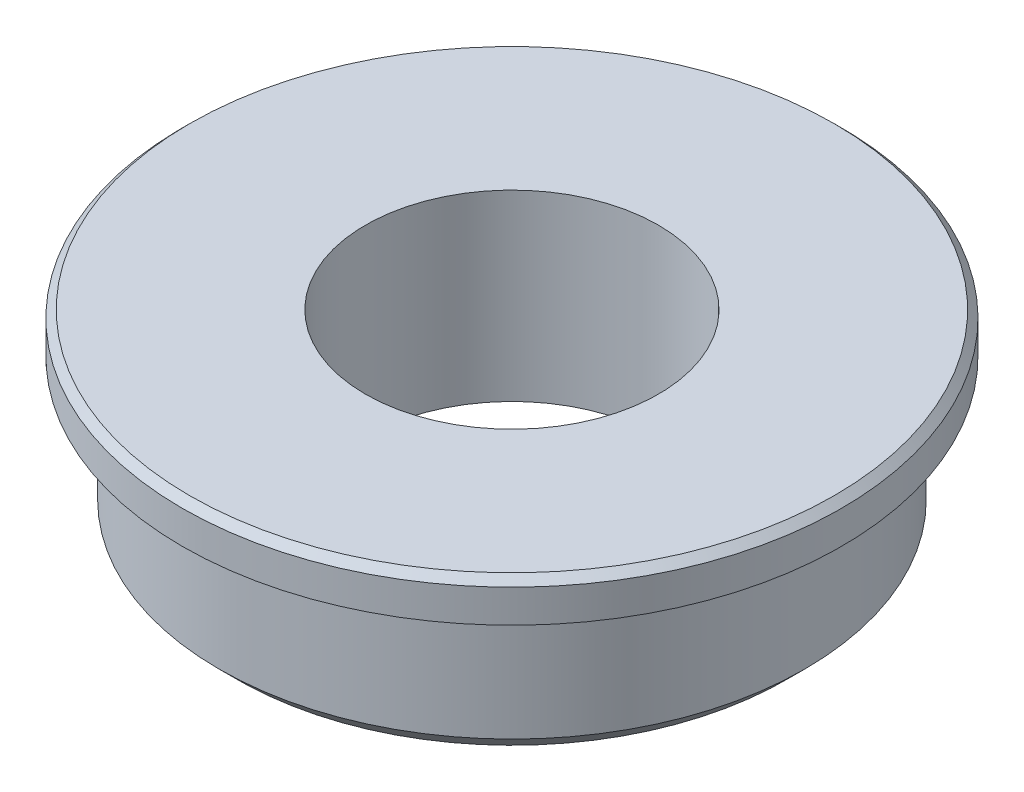
ISO-10303-21;
HEADER;
FILE_DESCRIPTION(('STEP AP214'),'2;1');
FILE_NAME('part.step','',(''),(''),'','','');
FILE_SCHEMA(('AUTOMOTIVE_DESIGN { 1 0 10303 214 1 1 1 1 }'));
ENDSEC;
DATA;
#1=APPLICATION_CONTEXT('core data for automotive mechanical design processes');
#2=APPLICATION_PROTOCOL_DEFINITION('international standard','automotive_design',2000,#1);
#3=PRODUCT_CONTEXT('',#1,'mechanical');
#4=PRODUCT('Part','Part','',(#3));
#5=PRODUCT_RELATED_PRODUCT_CATEGORY('part','',(#4));
#6=PRODUCT_DEFINITION_FORMATION('','',#4);
#7=PRODUCT_DEFINITION_CONTEXT('part definition',#1,'design');
#8=PRODUCT_DEFINITION('design','',#6,#7);
#9=PRODUCT_DEFINITION_SHAPE('','',#8);
#10=(LENGTH_UNIT() NAMED_UNIT(*) SI_UNIT(.MILLI.,.METRE.));
#11=(NAMED_UNIT(*) PLANE_ANGLE_UNIT() SI_UNIT($,.RADIAN.));
#12=(NAMED_UNIT(*) SI_UNIT($,.STERADIAN.) SOLID_ANGLE_UNIT());
#13=UNCERTAINTY_MEASURE_WITH_UNIT(LENGTH_MEASURE(1.E-05),#10,'distance_accuracy_value','');
#14=(GEOMETRIC_REPRESENTATION_CONTEXT(3) GLOBAL_UNCERTAINTY_ASSIGNED_CONTEXT((#13)) GLOBAL_UNIT_ASSIGNED_CONTEXT((#10,
#11,#12)) REPRESENTATION_CONTEXT('',''));
#15=CARTESIAN_POINT('',(0.,0.,0.));
#16=DIRECTION('',(0.,0.,1.));
#17=DIRECTION('',(1.,0.,0.));
#18=AXIS2_PLACEMENT_3D('',#15,#16,#17);
#19=CARTESIAN_POINT('',(0.,10.756386759865,0.));
#20=DIRECTION('',(0.,1.,0.));
#21=DIRECTION('',(0.,0.,1.));
#22=AXIS2_PLACEMENT_3D('',#19,#20,#21);
#23=CYLINDRICAL_SURFACE('',#22,4.);
#24=CARTESIAN_POINT('',(0.,5.,0.));
#25=DIRECTION('',(0.,1.,0.));
#26=DIRECTION('',(0.,0.,1.));
#27=AXIS2_PLACEMENT_3D('',#24,#25,#26);
#28=CIRCLE('',#27,4.);
#29=CARTESIAN_POINT('',(0.,5.,4.));
#30=VERTEX_POINT('',#29);
#31=EDGE_CURVE('E62',#30,#30,#28,.T.);
#32=ORIENTED_EDGE('',*,*,#31,.T.);
#33=EDGE_LOOP('',(#32));
#34=FACE_BOUND('',#33,.T.);
#35=CARTESIAN_POINT('',(0.,0.,0.));
#36=DIRECTION('',(0.,1.,0.));
#37=DIRECTION('',(0.,0.,1.));
#38=AXIS2_PLACEMENT_3D('',#35,#36,#37);
#39=CIRCLE('',#38,4.);
#40=CARTESIAN_POINT('',(0.,0.,4.));
#41=VERTEX_POINT('',#40);
#42=EDGE_CURVE('E53',#41,#41,#39,.T.);
#43=ORIENTED_EDGE('',*,*,#42,.F.);
#44=EDGE_LOOP('',(#43));
#45=FACE_BOUND('',#44,.T.);
#46=ADVANCED_FACE('F33',(#34,#45),#23,.F.);
#47=CARTESIAN_POINT('',(-4.,0.,0.));
#48=DIRECTION('',(0.,-1.,0.));
#49=DIRECTION('',(0.,0.,-1.));
#50=AXIS2_PLACEMENT_3D('',#47,#48,#49);
#51=PLANE('',#50);
#52=CARTESIAN_POINT('',(0.,0.,0.));
#53=DIRECTION('',(0.,-1.,0.));
#54=DIRECTION('',(0.,0.,-1.));
#55=AXIS2_PLACEMENT_3D('',#52,#53,#54);
#56=CIRCLE('',#55,7.49999999999999);
#57=CARTESIAN_POINT('',(0.,0.,-7.49999999999999));
#58=VERTEX_POINT('',#57);
#59=EDGE_CURVE('E44',#58,#58,#56,.T.);
#60=ORIENTED_EDGE('',*,*,#59,.T.);
#61=EDGE_LOOP('',(#60));
#62=FACE_BOUND('',#61,.T.);
#63=ORIENTED_EDGE('',*,*,#42,.T.);
#64=EDGE_LOOP('',(#63));
#65=FACE_BOUND('',#64,.T.);
#66=ADVANCED_FACE('F81',(#62,#65),#51,.T.);
#67=CARTESIAN_POINT('',(0.,10.756386759865,0.));
#68=DIRECTION('',(0.,1.,0.));
#69=DIRECTION('',(0.,0.,1.));
#70=AXIS2_PLACEMENT_3D('',#67,#68,#69);
#71=CYLINDRICAL_SURFACE('',#70,8.);
#72=CARTESIAN_POINT('',(0.,0.500000000000006,0.));
#73=DIRECTION('',(0.,-1.,0.));
#74=DIRECTION('',(0.,0.,-1.));
#75=AXIS2_PLACEMENT_3D('',#72,#73,#74);
#76=CIRCLE('',#75,8.);
#77=CARTESIAN_POINT('',(0.,0.500000000000006,-8.));
#78=VERTEX_POINT('',#77);
#79=EDGE_CURVE('E48',#78,#78,#76,.F.);
#80=ORIENTED_EDGE('',*,*,#79,.T.);
#81=EDGE_LOOP('',(#80));
#82=FACE_BOUND('',#81,.T.);
#83=CARTESIAN_POINT('',(0.,3.9,0.));
#84=DIRECTION('',(0.,1.,0.));
#85=DIRECTION('',(0.,0.,1.));
#86=AXIS2_PLACEMENT_3D('',#83,#84,#85);
#87=CIRCLE('',#86,8.);
#88=CARTESIAN_POINT('',(0.,3.9,8.));
#89=VERTEX_POINT('',#88);
#90=EDGE_CURVE('E56',#89,#89,#87,.T.);
#91=ORIENTED_EDGE('',*,*,#90,.F.);
#92=EDGE_LOOP('',(#91));
#93=FACE_BOUND('',#92,.T.);
#94=ADVANCED_FACE('F86',(#82,#93),#71,.T.);
#95=CARTESIAN_POINT('',(-8.,3.9,0.));
#96=DIRECTION('',(0.,-1.,0.));
#97=DIRECTION('',(0.,0.,-1.));
#98=AXIS2_PLACEMENT_3D('',#95,#96,#97);
#99=PLANE('',#98);
#100=ORIENTED_EDGE('',*,*,#90,.T.);
#101=EDGE_LOOP('',(#100));
#102=FACE_BOUND('',#101,.T.);
#103=CARTESIAN_POINT('',(0.,3.9,0.));
#104=DIRECTION('',(0.,1.,0.));
#105=DIRECTION('',(0.,0.,1.));
#106=AXIS2_PLACEMENT_3D('',#103,#104,#105);
#107=CIRCLE('',#106,9.);
#108=CARTESIAN_POINT('',(0.,3.9,9.));
#109=VERTEX_POINT('',#108);
#110=EDGE_CURVE('E59',#109,#109,#107,.T.);
#111=ORIENTED_EDGE('',*,*,#110,.F.);
#112=EDGE_LOOP('',(#111));
#113=FACE_BOUND('',#112,.T.);
#114=ADVANCED_FACE('F78',(#102,#113),#99,.T.);
#115=CARTESIAN_POINT('',(0.,10.756386759865,0.));
#116=DIRECTION('',(0.,1.,0.));
#117=DIRECTION('',(0.,0.,1.));
#118=AXIS2_PLACEMENT_3D('',#115,#116,#117);
#119=CYLINDRICAL_SURFACE('',#118,9.);
#120=CARTESIAN_POINT('',(0.,4.8,0.));
#121=DIRECTION('',(0.,1.,0.));
#122=DIRECTION('',(0.,0.,1.));
#123=AXIS2_PLACEMENT_3D('',#120,#121,#122);
#124=CIRCLE('',#123,9.);
#125=CARTESIAN_POINT('',(0.,4.8,9.));
#126=VERTEX_POINT('',#125);
#127=EDGE_CURVE('E10',#126,#126,#124,.F.);
#128=ORIENTED_EDGE('',*,*,#127,.T.);
#129=EDGE_LOOP('',(#128));
#130=FACE_BOUND('',#129,.T.);
#131=ORIENTED_EDGE('',*,*,#110,.T.);
#132=EDGE_LOOP('',(#131));
#133=FACE_BOUND('',#132,.T.);
#134=ADVANCED_FACE('F71',(#130,#133),#119,.T.);
#135=CARTESIAN_POINT('',(-9.,5.,0.));
#136=DIRECTION('',(0.,1.,0.));
#137=DIRECTION('',(0.,0.,1.));
#138=AXIS2_PLACEMENT_3D('',#135,#136,#137);
#139=PLANE('',#138);
#140=CARTESIAN_POINT('',(0.,5.,0.));
#141=DIRECTION('',(0.,1.,0.));
#142=DIRECTION('',(0.,0.,1.));
#143=AXIS2_PLACEMENT_3D('',#140,#141,#142);
#144=CIRCLE('',#143,8.80000000000001);
#145=CARTESIAN_POINT('',(0.,5.,8.80000000000001));
#146=VERTEX_POINT('',#145);
#147=EDGE_CURVE('E40',#146,#146,#144,.T.);
#148=ORIENTED_EDGE('',*,*,#147,.T.);
#149=EDGE_LOOP('',(#148));
#150=FACE_BOUND('',#149,.T.);
#151=ORIENTED_EDGE('',*,*,#31,.F.);
#152=EDGE_LOOP('',(#151));
#153=FACE_BOUND('',#152,.T.);
#154=ADVANCED_FACE('F68',(#150,#153),#139,.T.);
#155=CARTESIAN_POINT('',(0.,0.500000000000006,0.));
#156=DIRECTION('',(0.,1.,0.));
#157=DIRECTION('',(0.,0.,1.));
#158=AXIS2_PLACEMENT_3D('',#155,#156,#157);
#159=CONICAL_SURFACE('',#158,8.,0.78539816339745);
#160=ORIENTED_EDGE('',*,*,#59,.F.);
#161=EDGE_LOOP('',(#160));
#162=FACE_BOUND('',#161,.T.);
#163=ORIENTED_EDGE('',*,*,#79,.F.);
#164=EDGE_LOOP('',(#163));
#165=FACE_BOUND('',#164,.T.);
#166=ADVANCED_FACE('F70',(#162,#165),#159,.T.);
#167=CARTESIAN_POINT('',(0.,5.,0.));
#168=DIRECTION('',(0.,-1.,0.));
#169=DIRECTION('',(0.,0.,-1.));
#170=AXIS2_PLACEMENT_3D('',#167,#168,#169);
#171=CONICAL_SURFACE('',#170,8.80000000000001,0.78539816339744);
#172=ORIENTED_EDGE('',*,*,#127,.F.);
#173=EDGE_LOOP('',(#172));
#174=FACE_BOUND('',#173,.T.);
#175=ORIENTED_EDGE('',*,*,#147,.F.);
#176=EDGE_LOOP('',(#175));
#177=FACE_BOUND('',#176,.T.);
#178=ADVANCED_FACE('F35',(#174,#177),#171,.T.);
#179=CLOSED_SHELL('',(#46,#66,#94,#114,#134,#154,#166,#178));
#180=MANIFOLD_SOLID_BREP('B2',#179);
#181=ADVANCED_BREP_SHAPE_REPRESENTATION('',(#18,#180),#14);
#182=SHAPE_DEFINITION_REPRESENTATION(#9,#181);
ENDSEC;
END-ISO-10303-21;
